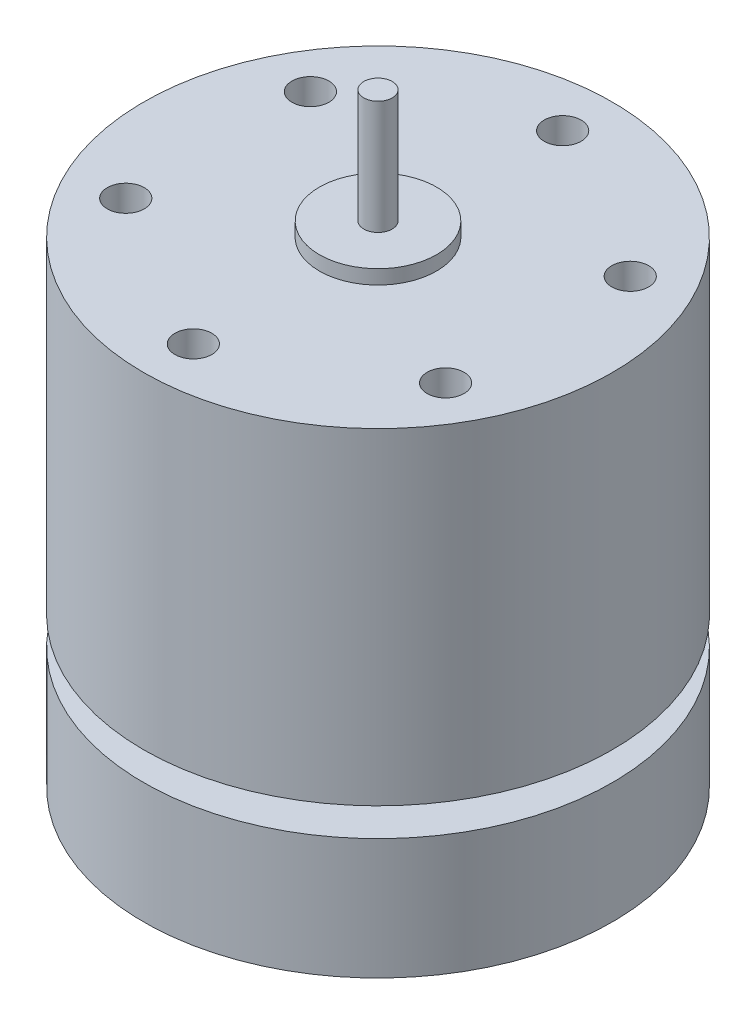
ISO-10303-21;
HEADER;
FILE_DESCRIPTION(('STEP AP214'),'2;1');
FILE_NAME('part.step','',(''),(''),'','','');
FILE_SCHEMA(('AUTOMOTIVE_DESIGN { 1 0 10303 214 1 1 1 1 }'));
ENDSEC;
DATA;
#1=APPLICATION_CONTEXT('core data for automotive mechanical design processes');
#2=APPLICATION_PROTOCOL_DEFINITION('international standard','automotive_design',2000,#1);
#3=PRODUCT_CONTEXT('',#1,'mechanical');
#4=PRODUCT('Part','Part','',(#3));
#5=PRODUCT_RELATED_PRODUCT_CATEGORY('part','',(#4));
#6=PRODUCT_DEFINITION_FORMATION('','',#4);
#7=PRODUCT_DEFINITION_CONTEXT('part definition',#1,'design');
#8=PRODUCT_DEFINITION('design','',#6,#7);
#9=PRODUCT_DEFINITION_SHAPE('','',#8);
#10=(LENGTH_UNIT() NAMED_UNIT(*) SI_UNIT(.MILLI.,.METRE.));
#11=(NAMED_UNIT(*) PLANE_ANGLE_UNIT() SI_UNIT($,.RADIAN.));
#12=(NAMED_UNIT(*) SI_UNIT($,.STERADIAN.) SOLID_ANGLE_UNIT());
#13=UNCERTAINTY_MEASURE_WITH_UNIT(LENGTH_MEASURE(1.E-05),#10,'distance_accuracy_value','');
#14=(GEOMETRIC_REPRESENTATION_CONTEXT(3) GLOBAL_UNCERTAINTY_ASSIGNED_CONTEXT((#13)) GLOBAL_UNIT_ASSIGNED_CONTEXT((#10,
#11,#12)) REPRESENTATION_CONTEXT('',''));
#15=CARTESIAN_POINT('',(0.,0.,0.));
#16=DIRECTION('',(0.,0.,1.));
#17=DIRECTION('',(1.,0.,0.));
#18=AXIS2_PLACEMENT_3D('',#15,#16,#17);
#19=CARTESIAN_POINT('',(0.,23.,0.));
#20=DIRECTION('',(0.,-1.,0.));
#21=DIRECTION('',(0.,0.,-1.));
#22=AXIS2_PLACEMENT_3D('',#19,#20,#21);
#23=CYLINDRICAL_SURFACE('',#22,16.5);
#24=CARTESIAN_POINT('',(0.,23.,0.));
#25=DIRECTION('',(0.,1.,0.));
#26=DIRECTION('',(0.,0.,1.));
#27=AXIS2_PLACEMENT_3D('',#24,#25,#26);
#28=CIRCLE('',#27,16.5);
#29=CARTESIAN_POINT('',(0.,23.,16.5));
#30=VERTEX_POINT('',#29);
#31=EDGE_CURVE('E39',#30,#30,#28,.T.);
#32=ORIENTED_EDGE('',*,*,#31,.F.);
#33=EDGE_LOOP('',(#32));
#34=FACE_BOUND('',#33,.T.);
#35=CARTESIAN_POINT('',(0.,0.,0.));
#36=DIRECTION('',(0.,1.,0.));
#37=DIRECTION('',(0.,0.,1.));
#38=AXIS2_PLACEMENT_3D('',#35,#36,#37);
#39=CIRCLE('',#38,16.5);
#40=CARTESIAN_POINT('',(0.,0.,16.5));
#41=VERTEX_POINT('',#40);
#42=EDGE_CURVE('E43',#41,#41,#39,.T.);
#43=ORIENTED_EDGE('',*,*,#42,.T.);
#44=EDGE_LOOP('',(#43));
#45=FACE_BOUND('',#44,.T.);
#46=ADVANCED_FACE('F33',(#34,#45),#23,.T.);
#47=CARTESIAN_POINT('',(0.,23.,0.));
#48=DIRECTION('',(0.,1.,0.));
#49=DIRECTION('',(0.,0.,1.));
#50=AXIS2_PLACEMENT_3D('',#47,#48,#49);
#51=PLANE('',#50);
#52=CARTESIAN_POINT('',(-11.2583302491978,23.,-6.4999999999999));
#53=DIRECTION('',(0.,1.,0.));
#54=DIRECTION('',(0.,0.,1.));
#55=AXIS2_PLACEMENT_3D('',#52,#53,#54);
#56=CIRCLE('',#55,1.3);
#57=CARTESIAN_POINT('',(-11.2583302491978,23.,-5.1999999999999));
#58=VERTEX_POINT('',#57);
#59=EDGE_CURVE('E101',#58,#58,#56,.T.);
#60=ORIENTED_EDGE('',*,*,#59,.F.);
#61=EDGE_LOOP('',(#60));
#62=FACE_BOUND('',#61,.T.);
#63=CARTESIAN_POINT('',(0.,23.,-13.));
#64=DIRECTION('',(0.,1.,0.));
#65=DIRECTION('',(0.,0.,1.));
#66=AXIS2_PLACEMENT_3D('',#63,#64,#65);
#67=CIRCLE('',#66,1.3);
#68=CARTESIAN_POINT('',(0.,23.,-11.7));
#69=VERTEX_POINT('',#68);
#70=EDGE_CURVE('E95',#69,#69,#67,.T.);
#71=ORIENTED_EDGE('',*,*,#70,.F.);
#72=EDGE_LOOP('',(#71));
#73=FACE_BOUND('',#72,.T.);
#74=CARTESIAN_POINT('',(11.2583302491977,23.,-6.50000000000005));
#75=DIRECTION('',(0.,1.,0.));
#76=DIRECTION('',(0.,0.,1.));
#77=AXIS2_PLACEMENT_3D('',#74,#75,#76);
#78=CIRCLE('',#77,1.3);
#79=CARTESIAN_POINT('',(11.2583302491977,23.,-5.20000000000005));
#80=VERTEX_POINT('',#79);
#81=EDGE_CURVE('E89',#80,#80,#78,.T.);
#82=ORIENTED_EDGE('',*,*,#81,.F.);
#83=EDGE_LOOP('',(#82));
#84=FACE_BOUND('',#83,.T.);
#85=CARTESIAN_POINT('',(11.2583302491977,23.,6.49999999999997));
#86=DIRECTION('',(0.,1.,0.));
#87=DIRECTION('',(0.,0.,1.));
#88=AXIS2_PLACEMENT_3D('',#85,#86,#87);
#89=CIRCLE('',#88,1.3);
#90=CARTESIAN_POINT('',(11.2583302491977,23.,7.79999999999997));
#91=VERTEX_POINT('',#90);
#92=EDGE_CURVE('E83',#91,#91,#89,.T.);
#93=ORIENTED_EDGE('',*,*,#92,.F.);
#94=EDGE_LOOP('',(#93));
#95=FACE_BOUND('',#94,.T.);
#96=CARTESIAN_POINT('',(0.,23.,13.));
#97=DIRECTION('',(0.,1.,0.));
#98=DIRECTION('',(0.,0.,1.));
#99=AXIS2_PLACEMENT_3D('',#96,#97,#98);
#100=CIRCLE('',#99,1.3);
#101=CARTESIAN_POINT('',(0.,23.,14.3));
#102=VERTEX_POINT('',#101);
#103=EDGE_CURVE('E77',#102,#102,#100,.T.);
#104=ORIENTED_EDGE('',*,*,#103,.F.);
#105=EDGE_LOOP('',(#104));
#106=FACE_BOUND('',#105,.T.);
#107=CARTESIAN_POINT('',(-11.2583302491976,23.,6.50000000000013));
#108=DIRECTION('',(0.,1.,0.));
#109=DIRECTION('',(0.,0.,1.));
#110=AXIS2_PLACEMENT_3D('',#107,#108,#109);
#111=CIRCLE('',#110,1.3);
#112=CARTESIAN_POINT('',(-11.2583302491976,23.,7.80000000000013));
#113=VERTEX_POINT('',#112);
#114=EDGE_CURVE('E71',#113,#113,#111,.T.);
#115=ORIENTED_EDGE('',*,*,#114,.F.);
#116=EDGE_LOOP('',(#115));
#117=FACE_BOUND('',#116,.T.);
#118=CARTESIAN_POINT('',(0.,23.,0.));
#119=DIRECTION('',(0.,1.,0.));
#120=DIRECTION('',(0.,0.,1.));
#121=AXIS2_PLACEMENT_3D('',#118,#119,#120);
#122=CIRCLE('',#121,4.125);
#123=CARTESIAN_POINT('',(0.,23.,4.125));
#124=VERTEX_POINT('',#123);
#125=EDGE_CURVE('E50',#124,#124,#122,.T.);
#126=ORIENTED_EDGE('',*,*,#125,.F.);
#127=EDGE_LOOP('',(#126));
#128=FACE_BOUND('',#127,.T.);
#129=ORIENTED_EDGE('',*,*,#31,.T.);
#130=EDGE_LOOP('',(#129));
#131=FACE_BOUND('',#130,.T.);
#132=ADVANCED_FACE('F116',(#62,#73,#84,#95,#106,#117,#128,#131),#51,.T.);
#133=CARTESIAN_POINT('',(0.,0.,0.));
#134=DIRECTION('',(0.,1.,0.));
#135=DIRECTION('',(0.,0.,1.));
#136=AXIS2_PLACEMENT_3D('',#133,#134,#135);
#137=PLANE('',#136);
#138=CARTESIAN_POINT('',(0.,0.,0.));
#139=DIRECTION('',(0.,1.,0.));
#140=DIRECTION('',(0.,0.,1.));
#141=AXIS2_PLACEMENT_3D('',#138,#139,#140);
#142=CIRCLE('',#141,3.);
#143=CARTESIAN_POINT('',(0.,0.,3.));
#144=VERTEX_POINT('',#143);
#145=EDGE_CURVE('E10',#144,#144,#142,.F.);
#146=ORIENTED_EDGE('',*,*,#145,.F.);
#147=EDGE_LOOP('',(#146));
#148=FACE_BOUND('',#147,.T.);
#149=ORIENTED_EDGE('',*,*,#42,.F.);
#150=EDGE_LOOP('',(#149));
#151=FACE_BOUND('',#150,.T.);
#152=ADVANCED_FACE('F119',(#148,#151),#137,.F.);
#153=CARTESIAN_POINT('',(0.,24.,0.));
#154=DIRECTION('',(0.,-1.,0.));
#155=DIRECTION('',(0.,0.,-1.));
#156=AXIS2_PLACEMENT_3D('',#153,#154,#155);
#157=CYLINDRICAL_SURFACE('',#156,4.125);
#158=CARTESIAN_POINT('',(0.,24.,0.));
#159=DIRECTION('',(0.,1.,0.));
#160=DIRECTION('',(0.,0.,1.));
#161=AXIS2_PLACEMENT_3D('',#158,#159,#160);
#162=CIRCLE('',#161,4.125);
#163=CARTESIAN_POINT('',(0.,24.,4.125));
#164=VERTEX_POINT('',#163);
#165=EDGE_CURVE('E48',#164,#164,#162,.T.);
#166=ORIENTED_EDGE('',*,*,#165,.F.);
#167=EDGE_LOOP('',(#166));
#168=FACE_BOUND('',#167,.T.);
#169=ORIENTED_EDGE('',*,*,#125,.T.);
#170=EDGE_LOOP('',(#169));
#171=FACE_BOUND('',#170,.T.);
#172=ADVANCED_FACE('F133',(#168,#171),#157,.T.);
#173=CARTESIAN_POINT('',(0.,24.,0.));
#174=DIRECTION('',(0.,1.,0.));
#175=DIRECTION('',(0.,0.,1.));
#176=AXIS2_PLACEMENT_3D('',#173,#174,#175);
#177=PLANE('',#176);
#178=CARTESIAN_POINT('',(0.,24.,0.));
#179=DIRECTION('',(0.,1.,0.));
#180=DIRECTION('',(0.,0.,1.));
#181=AXIS2_PLACEMENT_3D('',#178,#179,#180);
#182=CIRCLE('',#181,1.);
#183=CARTESIAN_POINT('',(0.,24.,1.));
#184=VERTEX_POINT('',#183);
#185=EDGE_CURVE('E56',#184,#184,#182,.T.);
#186=ORIENTED_EDGE('',*,*,#185,.F.);
#187=EDGE_LOOP('',(#186));
#188=FACE_BOUND('',#187,.T.);
#189=ORIENTED_EDGE('',*,*,#165,.T.);
#190=EDGE_LOOP('',(#189));
#191=FACE_BOUND('',#190,.T.);
#192=ADVANCED_FACE('F135',(#188,#191),#177,.T.);
#193=CARTESIAN_POINT('',(0.,32.,0.));
#194=DIRECTION('',(0.,-1.,0.));
#195=DIRECTION('',(0.,0.,-1.));
#196=AXIS2_PLACEMENT_3D('',#193,#194,#195);
#197=CYLINDRICAL_SURFACE('',#196,1.);
#198=CARTESIAN_POINT('',(0.,32.,0.));
#199=DIRECTION('',(0.,1.,0.));
#200=DIRECTION('',(0.,0.,1.));
#201=AXIS2_PLACEMENT_3D('',#198,#199,#200);
#202=CIRCLE('',#201,1.);
#203=CARTESIAN_POINT('',(0.,32.,1.));
#204=VERTEX_POINT('',#203);
#205=EDGE_CURVE('E53',#204,#204,#202,.T.);
#206=ORIENTED_EDGE('',*,*,#205,.F.);
#207=EDGE_LOOP('',(#206));
#208=FACE_BOUND('',#207,.T.);
#209=ORIENTED_EDGE('',*,*,#185,.T.);
#210=EDGE_LOOP('',(#209));
#211=FACE_BOUND('',#210,.T.);
#212=ADVANCED_FACE('F142',(#208,#211),#197,.T.);
#213=CARTESIAN_POINT('',(0.,32.,0.));
#214=DIRECTION('',(0.,1.,0.));
#215=DIRECTION('',(0.,0.,1.));
#216=AXIS2_PLACEMENT_3D('',#213,#214,#215);
#217=PLANE('',#216);
#218=ORIENTED_EDGE('',*,*,#205,.T.);
#219=EDGE_LOOP('',(#218));
#220=FACE_BOUND('',#219,.T.);
#221=ADVANCED_FACE('F173',(#220),#217,.T.);
#222=CARTESIAN_POINT('',(0.,-2.,0.));
#223=DIRECTION('',(0.,1.,0.));
#224=DIRECTION('',(0.,0.,1.));
#225=AXIS2_PLACEMENT_3D('',#222,#223,#224);
#226=CYLINDRICAL_SURFACE('',#225,3.);
#227=CARTESIAN_POINT('',(0.,-2.,0.));
#228=DIRECTION('',(0.,-1.,0.));
#229=DIRECTION('',(0.,0.,-1.));
#230=AXIS2_PLACEMENT_3D('',#227,#228,#229);
#231=CIRCLE('',#230,3.);
#232=CARTESIAN_POINT('',(0.,-2.,-3.));
#233=VERTEX_POINT('',#232);
#234=EDGE_CURVE('E59',#233,#233,#231,.T.);
#235=ORIENTED_EDGE('',*,*,#234,.F.);
#236=EDGE_LOOP('',(#235));
#237=FACE_BOUND('',#236,.T.);
#238=ORIENTED_EDGE('',*,*,#145,.T.);
#239=EDGE_LOOP('',(#238));
#240=FACE_BOUND('',#239,.T.);
#241=ADVANCED_FACE('F178',(#237,#240),#226,.T.);
#242=CARTESIAN_POINT('',(0.,-10.5,0.));
#243=DIRECTION('',(0.,1.,0.));
#244=DIRECTION('',(0.,0.,1.));
#245=AXIS2_PLACEMENT_3D('',#242,#243,#244);
#246=CYLINDRICAL_SURFACE('',#245,16.5);
#247=CARTESIAN_POINT('',(0.,-10.5,0.));
#248=DIRECTION('',(0.,-1.,0.));
#249=DIRECTION('',(0.,0.,-1.));
#250=AXIS2_PLACEMENT_3D('',#247,#248,#249);
#251=CIRCLE('',#250,16.5);
#252=CARTESIAN_POINT('',(0.,-10.5,-16.5));
#253=VERTEX_POINT('',#252);
#254=EDGE_CURVE('E64',#253,#253,#251,.T.);
#255=ORIENTED_EDGE('',*,*,#254,.F.);
#256=EDGE_LOOP('',(#255));
#257=FACE_BOUND('',#256,.T.);
#258=CARTESIAN_POINT('',(0.,-2.,0.));
#259=DIRECTION('',(0.,-1.,0.));
#260=DIRECTION('',(0.,0.,-1.));
#261=AXIS2_PLACEMENT_3D('',#258,#259,#260);
#262=CIRCLE('',#261,16.5);
#263=CARTESIAN_POINT('',(0.,-2.,-16.5));
#264=VERTEX_POINT('',#263);
#265=EDGE_CURVE('E65',#264,#264,#262,.T.);
#266=ORIENTED_EDGE('',*,*,#265,.T.);
#267=EDGE_LOOP('',(#266));
#268=FACE_BOUND('',#267,.T.);
#269=ADVANCED_FACE('F183',(#257,#268),#246,.T.);
#270=CARTESIAN_POINT('',(0.,-10.5,0.));
#271=DIRECTION('',(0.,-1.,0.));
#272=DIRECTION('',(0.,0.,-1.));
#273=AXIS2_PLACEMENT_3D('',#270,#271,#272);
#274=PLANE('',#273);
#275=ORIENTED_EDGE('',*,*,#254,.T.);
#276=EDGE_LOOP('',(#275));
#277=FACE_BOUND('',#276,.T.);
#278=ADVANCED_FACE('F193',(#277),#274,.T.);
#279=CARTESIAN_POINT('',(0.,-2.,0.));
#280=DIRECTION('',(0.,-1.,0.));
#281=DIRECTION('',(0.,0.,-1.));
#282=AXIS2_PLACEMENT_3D('',#279,#280,#281);
#283=PLANE('',#282);
#284=ORIENTED_EDGE('',*,*,#234,.T.);
#285=EDGE_LOOP('',(#284));
#286=FACE_BOUND('',#285,.T.);
#287=ORIENTED_EDGE('',*,*,#265,.F.);
#288=EDGE_LOOP('',(#287));
#289=FACE_BOUND('',#288,.T.);
#290=ADVANCED_FACE('F202',(#286,#289),#283,.F.);
#291=CARTESIAN_POINT('',(-11.2583302491976,21.,6.50000000000013));
#292=DIRECTION('',(0.,1.,0.));
#293=DIRECTION('',(0.,0.,1.));
#294=AXIS2_PLACEMENT_3D('',#291,#292,#293);
#295=CYLINDRICAL_SURFACE('',#294,1.3);
#296=CARTESIAN_POINT('',(-11.2583302491976,21.,6.50000000000013));
#297=DIRECTION('',(0.,1.,0.));
#298=DIRECTION('',(0.,0.,1.));
#299=AXIS2_PLACEMENT_3D('',#296,#297,#298);
#300=CIRCLE('',#299,1.3);
#301=CARTESIAN_POINT('',(-11.2583302491976,21.,7.80000000000013));
#302=VERTEX_POINT('',#301);
#303=EDGE_CURVE('E68',#302,#302,#300,.T.);
#304=ORIENTED_EDGE('',*,*,#303,.F.);
#305=EDGE_LOOP('',(#304));
#306=FACE_BOUND('',#305,.T.);
#307=ORIENTED_EDGE('',*,*,#114,.T.);
#308=EDGE_LOOP('',(#307));
#309=FACE_BOUND('',#308,.T.);
#310=ADVANCED_FACE('F211',(#306,#309),#295,.F.);
#311=CARTESIAN_POINT('',(0.,21.,0.));
#312=DIRECTION('',(0.,1.,0.));
#313=DIRECTION('',(0.,0.,1.));
#314=AXIS2_PLACEMENT_3D('',#311,#312,#313);
#315=PLANE('',#314);
#316=ORIENTED_EDGE('',*,*,#303,.T.);
#317=EDGE_LOOP('',(#316));
#318=FACE_BOUND('',#317,.T.);
#319=ADVANCED_FACE('F221',(#318),#315,.T.);
#320=CARTESIAN_POINT('',(0.,21.,13.));
#321=DIRECTION('',(0.,1.,0.));
#322=DIRECTION('',(0.,0.,1.));
#323=AXIS2_PLACEMENT_3D('',#320,#321,#322);
#324=CYLINDRICAL_SURFACE('',#323,1.3);
#325=CARTESIAN_POINT('',(0.,21.,13.));
#326=DIRECTION('',(0.,1.,0.));
#327=DIRECTION('',(0.,0.,1.));
#328=AXIS2_PLACEMENT_3D('',#325,#326,#327);
#329=CIRCLE('',#328,1.3);
#330=CARTESIAN_POINT('',(0.,21.,14.3));
#331=VERTEX_POINT('',#330);
#332=EDGE_CURVE('E74',#331,#331,#329,.T.);
#333=ORIENTED_EDGE('',*,*,#332,.F.);
#334=EDGE_LOOP('',(#333));
#335=FACE_BOUND('',#334,.T.);
#336=ORIENTED_EDGE('',*,*,#103,.T.);
#337=EDGE_LOOP('',(#336));
#338=FACE_BOUND('',#337,.T.);
#339=ADVANCED_FACE('F228',(#335,#338),#324,.F.);
#340=CARTESIAN_POINT('',(0.,21.,0.));
#341=DIRECTION('',(0.,1.,0.));
#342=DIRECTION('',(0.,0.,1.));
#343=AXIS2_PLACEMENT_3D('',#340,#341,#342);
#344=PLANE('',#343);
#345=ORIENTED_EDGE('',*,*,#332,.T.);
#346=EDGE_LOOP('',(#345));
#347=FACE_BOUND('',#346,.T.);
#348=ADVANCED_FACE('F236',(#347),#344,.T.);
#349=CARTESIAN_POINT('',(11.2583302491977,21.,6.49999999999997));
#350=DIRECTION('',(0.,1.,0.));
#351=DIRECTION('',(0.,0.,1.));
#352=AXIS2_PLACEMENT_3D('',#349,#350,#351);
#353=CYLINDRICAL_SURFACE('',#352,1.3);
#354=CARTESIAN_POINT('',(11.2583302491977,21.,6.49999999999997));
#355=DIRECTION('',(0.,1.,0.));
#356=DIRECTION('',(0.,0.,1.));
#357=AXIS2_PLACEMENT_3D('',#354,#355,#356);
#358=CIRCLE('',#357,1.3);
#359=CARTESIAN_POINT('',(11.2583302491977,21.,7.79999999999997));
#360=VERTEX_POINT('',#359);
#361=EDGE_CURVE('E80',#360,#360,#358,.T.);
#362=ORIENTED_EDGE('',*,*,#361,.F.);
#363=EDGE_LOOP('',(#362));
#364=FACE_BOUND('',#363,.T.);
#365=ORIENTED_EDGE('',*,*,#92,.T.);
#366=EDGE_LOOP('',(#365));
#367=FACE_BOUND('',#366,.T.);
#368=ADVANCED_FACE('F244',(#364,#367),#353,.F.);
#369=CARTESIAN_POINT('',(0.,21.,0.));
#370=DIRECTION('',(0.,1.,0.));
#371=DIRECTION('',(0.,0.,1.));
#372=AXIS2_PLACEMENT_3D('',#369,#370,#371);
#373=PLANE('',#372);
#374=ORIENTED_EDGE('',*,*,#361,.T.);
#375=EDGE_LOOP('',(#374));
#376=FACE_BOUND('',#375,.T.);
#377=ADVANCED_FACE('F252',(#376),#373,.T.);
#378=CARTESIAN_POINT('',(11.2583302491977,21.,-6.50000000000005));
#379=DIRECTION('',(0.,1.,0.));
#380=DIRECTION('',(0.,0.,1.));
#381=AXIS2_PLACEMENT_3D('',#378,#379,#380);
#382=CYLINDRICAL_SURFACE('',#381,1.3);
#383=CARTESIAN_POINT('',(11.2583302491977,21.,-6.50000000000005));
#384=DIRECTION('',(0.,1.,0.));
#385=DIRECTION('',(0.,0.,1.));
#386=AXIS2_PLACEMENT_3D('',#383,#384,#385);
#387=CIRCLE('',#386,1.3);
#388=CARTESIAN_POINT('',(11.2583302491977,21.,-5.20000000000005));
#389=VERTEX_POINT('',#388);
#390=EDGE_CURVE('E86',#389,#389,#387,.T.);
#391=ORIENTED_EDGE('',*,*,#390,.F.);
#392=EDGE_LOOP('',(#391));
#393=FACE_BOUND('',#392,.T.);
#394=ORIENTED_EDGE('',*,*,#81,.T.);
#395=EDGE_LOOP('',(#394));
#396=FACE_BOUND('',#395,.T.);
#397=ADVANCED_FACE('F260',(#393,#396),#382,.F.);
#398=CARTESIAN_POINT('',(0.,21.,0.));
#399=DIRECTION('',(0.,1.,0.));
#400=DIRECTION('',(0.,0.,1.));
#401=AXIS2_PLACEMENT_3D('',#398,#399,#400);
#402=PLANE('',#401);
#403=ORIENTED_EDGE('',*,*,#390,.T.);
#404=EDGE_LOOP('',(#403));
#405=FACE_BOUND('',#404,.T.);
#406=ADVANCED_FACE('F268',(#405),#402,.T.);
#407=CARTESIAN_POINT('',(0.,21.,-13.));
#408=DIRECTION('',(0.,1.,0.));
#409=DIRECTION('',(0.,0.,1.));
#410=AXIS2_PLACEMENT_3D('',#407,#408,#409);
#411=CYLINDRICAL_SURFACE('',#410,1.3);
#412=CARTESIAN_POINT('',(0.,21.,-13.));
#413=DIRECTION('',(0.,1.,0.));
#414=DIRECTION('',(0.,0.,1.));
#415=AXIS2_PLACEMENT_3D('',#412,#413,#414);
#416=CIRCLE('',#415,1.3);
#417=CARTESIAN_POINT('',(0.,21.,-11.7));
#418=VERTEX_POINT('',#417);
#419=EDGE_CURVE('E92',#418,#418,#416,.T.);
#420=ORIENTED_EDGE('',*,*,#419,.F.);
#421=EDGE_LOOP('',(#420));
#422=FACE_BOUND('',#421,.T.);
#423=ORIENTED_EDGE('',*,*,#70,.T.);
#424=EDGE_LOOP('',(#423));
#425=FACE_BOUND('',#424,.T.);
#426=ADVANCED_FACE('F276',(#422,#425),#411,.F.);
#427=CARTESIAN_POINT('',(0.,21.,0.));
#428=DIRECTION('',(0.,1.,0.));
#429=DIRECTION('',(0.,0.,1.));
#430=AXIS2_PLACEMENT_3D('',#427,#428,#429);
#431=PLANE('',#430);
#432=ORIENTED_EDGE('',*,*,#419,.T.);
#433=EDGE_LOOP('',(#432));
#434=FACE_BOUND('',#433,.T.);
#435=ADVANCED_FACE('F112',(#434),#431,.T.);
#436=CARTESIAN_POINT('',(-11.2583302491978,21.,-6.4999999999999));
#437=DIRECTION('',(0.,1.,0.));
#438=DIRECTION('',(0.,0.,1.));
#439=AXIS2_PLACEMENT_3D('',#436,#437,#438);
#440=CYLINDRICAL_SURFACE('',#439,1.3);
#441=CARTESIAN_POINT('',(-11.2583302491978,21.,-6.4999999999999));
#442=DIRECTION('',(0.,1.,0.));
#443=DIRECTION('',(0.,0.,1.));
#444=AXIS2_PLACEMENT_3D('',#441,#442,#443);
#445=CIRCLE('',#444,1.3);
#446=CARTESIAN_POINT('',(-11.2583302491978,21.,-5.1999999999999));
#447=VERTEX_POINT('',#446);
#448=EDGE_CURVE('E98',#447,#447,#445,.T.);
#449=ORIENTED_EDGE('',*,*,#448,.F.);
#450=EDGE_LOOP('',(#449));
#451=FACE_BOUND('',#450,.T.);
#452=ORIENTED_EDGE('',*,*,#59,.T.);
#453=EDGE_LOOP('',(#452));
#454=FACE_BOUND('',#453,.T.);
#455=ADVANCED_FACE('F109',(#451,#454),#440,.F.);
#456=CARTESIAN_POINT('',(0.,21.,0.));
#457=DIRECTION('',(0.,1.,0.));
#458=DIRECTION('',(0.,0.,1.));
#459=AXIS2_PLACEMENT_3D('',#456,#457,#458);
#460=PLANE('',#459);
#461=ORIENTED_EDGE('',*,*,#448,.T.);
#462=EDGE_LOOP('',(#461));
#463=FACE_BOUND('',#462,.T.);
#464=ADVANCED_FACE('F107',(#463),#460,.T.);
#465=CLOSED_SHELL('',(#46,#132,#152,#172,#192,#212,#221,#241,#269,#278,#290,#310,#319,#339,#348,
#368,#377,#397,#406,#426,#435,#455,#464));
#466=MANIFOLD_SOLID_BREP('B2',#465);
#467=ADVANCED_BREP_SHAPE_REPRESENTATION('',(#18,#466),#14);
#468=SHAPE_DEFINITION_REPRESENTATION(#9,#467);
ENDSEC;
END-ISO-10303-21;
